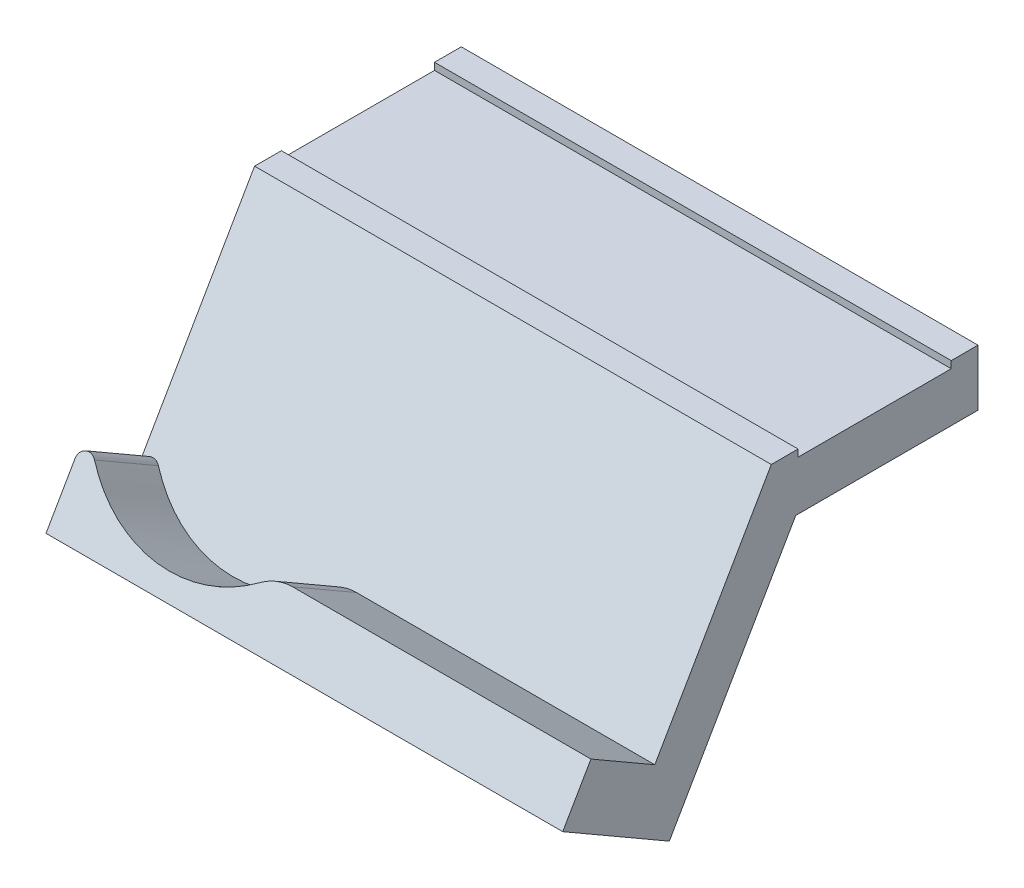
ISO-10303-21;
HEADER;
FILE_DESCRIPTION(('STEP AP214'),'2;1');
FILE_NAME('part.step','',(''),(''),'','','');
FILE_SCHEMA(('AUTOMOTIVE_DESIGN { 1 0 10303 214 1 1 1 1 }'));
ENDSEC;
DATA;
#1=APPLICATION_CONTEXT('core data for automotive mechanical design processes');
#2=APPLICATION_PROTOCOL_DEFINITION('international standard','automotive_design',2000,#1);
#3=PRODUCT_CONTEXT('',#1,'mechanical');
#4=PRODUCT('Part','Part','',(#3));
#5=PRODUCT_RELATED_PRODUCT_CATEGORY('part','',(#4));
#6=PRODUCT_DEFINITION_FORMATION('','',#4);
#7=PRODUCT_DEFINITION_CONTEXT('part definition',#1,'design');
#8=PRODUCT_DEFINITION('design','',#6,#7);
#9=PRODUCT_DEFINITION_SHAPE('','',#8);
#10=(LENGTH_UNIT() NAMED_UNIT(*) SI_UNIT(.MILLI.,.METRE.));
#11=(NAMED_UNIT(*) PLANE_ANGLE_UNIT() SI_UNIT($,.RADIAN.));
#12=(NAMED_UNIT(*) SI_UNIT($,.STERADIAN.) SOLID_ANGLE_UNIT());
#13=UNCERTAINTY_MEASURE_WITH_UNIT(LENGTH_MEASURE(1.E-05),#10,'distance_accuracy_value','');
#14=(GEOMETRIC_REPRESENTATION_CONTEXT(3) GLOBAL_UNCERTAINTY_ASSIGNED_CONTEXT((#13)) GLOBAL_UNIT_ASSIGNED_CONTEXT((#10,
#11,#12)) REPRESENTATION_CONTEXT('',''));
#15=CARTESIAN_POINT('',(0.,0.,0.));
#16=DIRECTION('',(0.,0.,1.));
#17=DIRECTION('',(1.,0.,0.));
#18=AXIS2_PLACEMENT_3D('',#15,#16,#17);
#19=CARTESIAN_POINT('',(55.,31.0444173119616,-43.45));
#20=DIRECTION('',(0.,-1.,0.));
#21=DIRECTION('',(0.,0.,-1.));
#22=AXIS2_PLACEMENT_3D('',#19,#20,#21);
#23=PLANE('',#22);
#24=DIRECTION('',(0.,0.,1.));
#25=VECTOR('',#24,1.);
#26=CARTESIAN_POINT('',(0.,31.0444173119616,-43.45));
#27=LINE('',#26,#25);
#28=CARTESIAN_POINT('',(0.,31.0444173119616,-43.45));
#29=VERTEX_POINT('',#28);
#30=CARTESIAN_POINT('',(0.,31.0444173119616,-40.6));
#31=VERTEX_POINT('',#30);
#32=EDGE_CURVE('E215',#29,#31,#27,.T.);
#33=ORIENTED_EDGE('',*,*,#32,.T.);
#34=DIRECTION('',(-1.,0.,0.));
#35=VECTOR('',#34,1.);
#36=CARTESIAN_POINT('',(0.,31.0444173119616,-40.6));
#37=LINE('',#36,#35);
#38=CARTESIAN_POINT('',(55.,31.0444173119616,-40.6));
#39=VERTEX_POINT('',#38);
#40=EDGE_CURVE('E179',#39,#31,#37,.T.);
#41=ORIENTED_EDGE('',*,*,#40,.F.);
#42=DIRECTION('',(0.,0.,1.));
#43=VECTOR('',#42,1.);
#44=CARTESIAN_POINT('',(55.,31.0444173119616,-43.45));
#45=LINE('',#44,#43);
#46=CARTESIAN_POINT('',(55.,31.0444173119616,-43.45));
#47=VERTEX_POINT('',#46);
#48=EDGE_CURVE('E211',#47,#39,#45,.T.);
#49=ORIENTED_EDGE('',*,*,#48,.F.);
#50=DIRECTION('',(1.,0.,0.));
#51=VECTOR('',#50,1.);
#52=CARTESIAN_POINT('',(55.,31.0444173119616,-43.45));
#53=LINE('',#52,#51);
#54=EDGE_CURVE('E208',#29,#47,#53,.T.);
#55=ORIENTED_EDGE('',*,*,#54,.F.);
#56=EDGE_LOOP('',(#33,#41,#49,#55));
#57=FACE_BOUND('',#56,.T.);
#58=ADVANCED_FACE('F35',(#57),#23,.F.);
#59=CARTESIAN_POINT('',(0.,80.,-25.95));
#60=DIRECTION('',(1.,0.,0.));
#61=DIRECTION('',(0.,0.,-1.));
#62=AXIS2_PLACEMENT_3D('',#59,#60,#61);
#63=PLANE('',#62);
#64=DIRECTION('',(0.,0.,1.));
#65=VECTOR('',#64,1.);
#66=CARTESIAN_POINT('',(0.,30.2944173119616,-40.6));
#67=LINE('',#66,#65);
#68=CARTESIAN_POINT('',(0.,30.2944173119616,-40.6));
#69=VERTEX_POINT('',#68);
#70=CARTESIAN_POINT('',(0.,30.2944173119616,-24.3));
#71=VERTEX_POINT('',#70);
#72=EDGE_CURVE('E175',#69,#71,#67,.T.);
#73=ORIENTED_EDGE('',*,*,#72,.F.);
#74=DIRECTION('',(0.,1.,0.));
#75=VECTOR('',#74,1.);
#76=CARTESIAN_POINT('',(0.,30.2944173119616,-40.6));
#77=LINE('',#76,#75);
#78=EDGE_CURVE('E189',#69,#31,#77,.T.);
#79=ORIENTED_EDGE('',*,*,#78,.T.);
#80=ORIENTED_EDGE('',*,*,#32,.F.);
#81=DIRECTION('',(0.,1.,0.));
#82=VECTOR('',#81,1.);
#83=CARTESIAN_POINT('',(0.,31.0444173119616,-43.45));
#84=LINE('',#83,#82);
#85=CARTESIAN_POINT('',(0.,25.0444173119616,-43.45));
#86=VERTEX_POINT('',#85);
#87=EDGE_CURVE('E206',#86,#29,#84,.T.);
#88=ORIENTED_EDGE('',*,*,#87,.F.);
#89=DIRECTION('',(0.,0.,1.));
#90=VECTOR('',#89,1.);
#91=CARTESIAN_POINT('',(0.,25.0444173119616,-43.45));
#92=LINE('',#91,#90);
#93=CARTESIAN_POINT('',(0.,25.0444173119616,-24.0480762113533));
#94=VERTEX_POINT('',#93);
#95=EDGE_CURVE('E218',#86,#94,#92,.T.);
#96=ORIENTED_EDGE('',*,*,#95,.T.);
#97=DIRECTION('',(0.,-0.866025403784439,0.5));
#98=VECTOR('',#97,1.);
#99=CARTESIAN_POINT('',(0.,20.5444173119616,-21.45));
#100=LINE('',#99,#98);
#101=CARTESIAN_POINT('',(0.,1.7458348754011,-10.5966333698684));
#102=VERTEX_POINT('',#101);
#103=EDGE_CURVE('E219',#94,#102,#100,.T.);
#104=ORIENTED_EDGE('',*,*,#103,.T.);
#105=DIRECTION('',(0.,0.5,0.866025403784439));
#106=VECTOR('',#105,1.);
#107=CARTESIAN_POINT('',(0.,8.29681670589062,0.750000000000018));
#108=LINE('',#107,#106);
#109=CARTESIAN_POINT('',(0.,8.29681670589062,0.750000000000018));
#110=VERTEX_POINT('',#109);
#111=EDGE_CURVE('E171',#102,#110,#108,.T.);
#112=ORIENTED_EDGE('',*,*,#111,.T.);
#113=DIRECTION('',(0.,0.866025403784439,-0.499999999999999));
#114=VECTOR('',#113,1.);
#115=CARTESIAN_POINT('',(0.,5.2657277926451,2.49999999999998));
#116=LINE('',#115,#114);
#117=CARTESIAN_POINT('',(0.,13.643118878009,-2.33668899824161));
#118=VERTEX_POINT('',#117);
#119=EDGE_CURVE('E154',#110,#118,#116,.T.);
#120=ORIENTED_EDGE('',*,*,#119,.T.);
#121=DIRECTION('',(0.,0.500000000000004,0.866025403784436));
#122=VECTOR('',#121,1.);
#123=CARTESIAN_POINT('',(0.,9.71713704751949,-9.1366889982416));
#124=LINE('',#123,#122);
#125=CARTESIAN_POINT('',(0.,9.71713704751948,-9.1366889982416));
#126=VERTEX_POINT('',#125);
#127=EDGE_CURVE('E247',#118,#126,#124,.F.);
#128=ORIENTED_EDGE('',*,*,#127,.T.);
#129=DIRECTION('',(0.,-0.866025403784436,0.500000000000004));
#130=VECTOR('',#129,1.);
#131=CARTESIAN_POINT('',(0.,69.7096614865052,-43.7733891324556));
#132=LINE('',#131,#130);
#133=CARTESIAN_POINT('',(0.,31.0444173119616,-21.45));
#134=VERTEX_POINT('',#133);
#135=EDGE_CURVE('E229',#134,#126,#132,.T.);
#136=ORIENTED_EDGE('',*,*,#135,.F.);
#137=CARTESIAN_POINT('',(0.,31.0444173119616,-24.3));
#138=VERTEX_POINT('',#137);
#139=EDGE_CURVE('E214',#138,#134,#27,.T.);
#140=ORIENTED_EDGE('',*,*,#139,.F.);
#141=DIRECTION('',(0.,1.,0.));
#142=VECTOR('',#141,1.);
#143=CARTESIAN_POINT('',(0.,30.2944173119616,-24.3));
#144=LINE('',#143,#142);
#145=EDGE_CURVE('E52',#71,#138,#144,.T.);
#146=ORIENTED_EDGE('',*,*,#145,.F.);
#147=EDGE_LOOP('',(#73,#79,#80,#88,#96,#104,#112,#120,#128,#136,#140,#146));
#148=FACE_BOUND('',#147,.T.);
#149=ADVANCED_FACE('F272',(#148),#63,.F.);
#150=CARTESIAN_POINT('',(55.,80.,-25.95));
#151=DIRECTION('',(1.,0.,0.));
#152=DIRECTION('',(0.,0.,-1.));
#153=AXIS2_PLACEMENT_3D('',#150,#151,#152);
#154=PLANE('',#153);
#155=DIRECTION('',(0.,1.,0.));
#156=VECTOR('',#155,1.);
#157=CARTESIAN_POINT('',(55.,30.2944173119616,-40.6));
#158=LINE('',#157,#156);
#159=CARTESIAN_POINT('',(55.,30.2944173119616,-40.6));
#160=VERTEX_POINT('',#159);
#161=EDGE_CURVE('E193',#160,#39,#158,.T.);
#162=ORIENTED_EDGE('',*,*,#161,.F.);
#163=DIRECTION('',(0.,0.,-1.));
#164=VECTOR('',#163,1.);
#165=CARTESIAN_POINT('',(55.,30.2944173119616,-40.6));
#166=LINE('',#165,#164);
#167=CARTESIAN_POINT('',(55.,30.2944173119616,-24.3));
#168=VERTEX_POINT('',#167);
#169=EDGE_CURVE('E182',#168,#160,#166,.T.);
#170=ORIENTED_EDGE('',*,*,#169,.F.);
#171=DIRECTION('',(0.,1.,0.));
#172=VECTOR('',#171,1.);
#173=CARTESIAN_POINT('',(55.,30.2944173119616,-24.3));
#174=LINE('',#173,#172);
#175=CARTESIAN_POINT('',(55.,31.0444173119616,-24.3));
#176=VERTEX_POINT('',#175);
#177=EDGE_CURVE('E195',#168,#176,#174,.T.);
#178=ORIENTED_EDGE('',*,*,#177,.T.);
#179=CARTESIAN_POINT('',(55.,31.0444173119616,-21.45));
#180=VERTEX_POINT('',#179);
#181=EDGE_CURVE('E210',#176,#180,#45,.T.);
#182=ORIENTED_EDGE('',*,*,#181,.T.);
#183=DIRECTION('',(0.,0.866025403784436,-0.500000000000004));
#184=VECTOR('',#183,1.);
#185=CARTESIAN_POINT('',(55.,9.99999999999999,-9.3));
#186=LINE('',#185,#184);
#187=CARTESIAN_POINT('',(55.,9.56698729810782,-9.05000000000003));
#188=VERTEX_POINT('',#187);
#189=EDGE_CURVE('E238',#188,#180,#186,.T.);
#190=ORIENTED_EDGE('',*,*,#189,.F.);
#191=DIRECTION('',(0.,-0.5,-0.866025403784439));
#192=VECTOR('',#191,1.);
#193=CARTESIAN_POINT('',(55.,13.4929691285973,-2.25000000000002));
#194=LINE('',#193,#192);
#195=CARTESIAN_POINT('',(55.,13.4929691285973,-2.25000000000002));
#196=VERTEX_POINT('',#195);
#197=EDGE_CURVE('E151',#196,#188,#194,.T.);
#198=ORIENTED_EDGE('',*,*,#197,.F.);
#199=DIRECTION('',(0.,0.866025403784439,-0.499999999999999));
#200=VECTOR('',#199,1.);
#201=CARTESIAN_POINT('',(55.,5.2657277926451,2.49999999999998));
#202=LINE('',#201,#200);
#203=CARTESIAN_POINT('',(55.,8.29681670589062,0.750000000000002));
#204=VERTEX_POINT('',#203);
#205=EDGE_CURVE('E143',#204,#196,#202,.T.);
#206=ORIENTED_EDGE('',*,*,#205,.F.);
#207=DIRECTION('',(0.,-0.5,-0.866025403784439));
#208=VECTOR('',#207,1.);
#209=CARTESIAN_POINT('',(55.,8.29681670589062,0.750000000000002));
#210=LINE('',#209,#208);
#211=CARTESIAN_POINT('',(55.,1.7458348754011,-10.5966333698684));
#212=VERTEX_POINT('',#211);
#213=EDGE_CURVE('E148',#204,#212,#210,.T.);
#214=ORIENTED_EDGE('',*,*,#213,.T.);
#215=DIRECTION('',(0.,-0.866025403784439,0.5));
#216=VECTOR('',#215,1.);
#217=CARTESIAN_POINT('',(55.,20.5444173119616,-21.45));
#218=LINE('',#217,#216);
#219=CARTESIAN_POINT('',(55.,25.0444173119616,-24.0480762113533));
#220=VERTEX_POINT('',#219);
#221=EDGE_CURVE('E222',#220,#212,#218,.T.);
#222=ORIENTED_EDGE('',*,*,#221,.F.);
#223=DIRECTION('',(0.,0.,1.));
#224=VECTOR('',#223,1.);
#225=CARTESIAN_POINT('',(55.,25.0444173119616,-43.45));
#226=LINE('',#225,#224);
#227=CARTESIAN_POINT('',(55.,25.0444173119616,-43.45));
#228=VERTEX_POINT('',#227);
#229=EDGE_CURVE('E224',#228,#220,#226,.T.);
#230=ORIENTED_EDGE('',*,*,#229,.F.);
#231=DIRECTION('',(0.,-1.,0.));
#232=VECTOR('',#231,1.);
#233=CARTESIAN_POINT('',(55.,31.0444173119616,-43.45));
#234=LINE('',#233,#232);
#235=EDGE_CURVE('E201',#47,#228,#234,.T.);
#236=ORIENTED_EDGE('',*,*,#235,.F.);
#237=ORIENTED_EDGE('',*,*,#48,.T.);
#238=EDGE_LOOP('',(#162,#170,#178,#182,#190,#198,#206,#214,#222,#230,#236,#237));
#239=FACE_BOUND('',#238,.T.);
#240=ADVANCED_FACE('F146',(#239),#154,.T.);
#241=CARTESIAN_POINT('',(5.,9.99999999999999,-9.3));
#242=DIRECTION('',(0.,-0.500000000000004,-0.866025403784436));
#243=DIRECTION('',(0.,0.866025403784437,-0.500000000000004));
#244=AXIS2_PLACEMENT_3D('',#241,#242,#243);
#245=PLANE('',#244);
#246=ORIENTED_EDGE('',*,*,#189,.T.);
#247=DIRECTION('',(1.,0.,0.));
#248=VECTOR('',#247,1.);
#249=CARTESIAN_POINT('',(0.,31.0444173119616,-21.45));
#250=LINE('',#249,#248);
#251=EDGE_CURVE('E221',#134,#180,#250,.T.);
#252=ORIENTED_EDGE('',*,*,#251,.F.);
#253=ORIENTED_EDGE('',*,*,#135,.T.);
#254=CARTESIAN_POINT('',(1.,9.71713704751948,-9.1366889982416));
#255=DIRECTION('',(0.,-0.500000000000004,-0.866025403784436));
#256=DIRECTION('',(0.,0.866025403784437,-0.500000000000004));
#257=AXIS2_PLACEMENT_3D('',#254,#255,#256);
#258=CIRCLE('',#257,1.);
#259=CARTESIAN_POINT('',(1.7457627118644,10.2940932704641,-9.4697948288693));
#260=VERTEX_POINT('',#259);
#261=EDGE_CURVE('E250',#126,#260,#258,.T.);
#262=ORIENTED_EDGE('',*,*,#261,.T.);
#263=CARTESIAN_POINT('',(12.,18.2272413359521,-14.05));
#264=DIRECTION('',(0.,0.500000000000004,0.866025403784436));
#265=DIRECTION('',(0.,-0.866025403784436,0.500000000000004));
#266=AXIS2_PLACEMENT_3D('',#263,#264,#265);
#267=CIRCLE('',#266,13.75);
#268=CARTESIAN_POINT('',(20.2499999999999,8.70096189432322,-8.54999999999993));
#269=VERTEX_POINT('',#268);
#270=EDGE_CURVE('E227',#260,#269,#267,.T.);
#271=ORIENTED_EDGE('',*,*,#270,.T.);
#272=CARTESIAN_POINT('',(23.2499999999998,5.23686027918544,-6.54999999999989));
#273=DIRECTION('',(0.,-0.500000000000004,-0.866025403784436));
#274=DIRECTION('',(0.,0.866025403784437,-0.500000000000004));
#275=AXIS2_PLACEMENT_3D('',#272,#273,#274);
#276=CIRCLE('',#275,5.);
#277=CARTESIAN_POINT('',(23.2499999999998,9.56698729810782,-9.05000000000002));
#278=VERTEX_POINT('',#277);
#279=EDGE_CURVE('E11',#269,#278,#276,.T.);
#280=ORIENTED_EDGE('',*,*,#279,.T.);
#281=DIRECTION('',(1.,0.,0.));
#282=VECTOR('',#281,1.);
#283=CARTESIAN_POINT('',(-4.18168466749612,9.56698729810782,-9.05000000000002));
#284=LINE('',#283,#282);
#285=EDGE_CURVE('E155',#278,#188,#284,.T.);
#286=ORIENTED_EDGE('',*,*,#285,.T.);
#287=EDGE_LOOP('',(#246,#252,#253,#262,#271,#280,#286));
#288=FACE_BOUND('',#287,.T.);
#289=ADVANCED_FACE('F293',(#288),#245,.F.);
#290=CARTESIAN_POINT('',(-4.18168466749612,13.4929691285973,-2.25));
#291=DIRECTION('',(0.,-0.866025403784439,0.5));
#292=DIRECTION('',(0.,-0.5,-0.866025403784439));
#293=AXIS2_PLACEMENT_3D('',#290,#291,#292);
#294=PLANE('',#293);
#295=ORIENTED_EDGE('',*,*,#285,.F.);
#296=DIRECTION('',(0.,0.5,0.866025403784439));
#297=VECTOR('',#296,1.);
#298=CARTESIAN_POINT('',(23.2499999999998,13.4929691285972,-2.25000000000007));
#299=LINE('',#298,#297);
#300=CARTESIAN_POINT('',(23.2499999999998,13.4929691285973,-2.25000000000001));
#301=VERTEX_POINT('',#300);
#302=EDGE_CURVE('E255',#278,#301,#299,.T.);
#303=ORIENTED_EDGE('',*,*,#302,.T.);
#304=DIRECTION('',(1.,0.,0.));
#305=VECTOR('',#304,1.);
#306=CARTESIAN_POINT('',(-4.18168466749612,13.4929691285973,-2.25));
#307=LINE('',#306,#305);
#308=EDGE_CURVE('E235',#301,#196,#307,.T.);
#309=ORIENTED_EDGE('',*,*,#308,.T.);
#310=ORIENTED_EDGE('',*,*,#197,.T.);
#311=EDGE_LOOP('',(#295,#303,#309,#310));
#312=FACE_BOUND('',#311,.T.);
#313=ADVANCED_FACE('F295',(#312),#294,.F.);
#314=CARTESIAN_POINT('',(0.,5.2657277926451,2.49999999999998));
#315=DIRECTION('',(0.,-0.499999999999999,-0.866025403784439));
#316=DIRECTION('',(0.,0.866025403784439,-0.499999999999999));
#317=AXIS2_PLACEMENT_3D('',#314,#315,#316);
#318=PLANE('',#317);
#319=ORIENTED_EDGE('',*,*,#308,.F.);
#320=CARTESIAN_POINT('',(23.2499999999998,9.16284210967492,0.250000000000077));
#321=DIRECTION('',(0.,-0.499999999999999,-0.866025403784439));
#322=DIRECTION('',(0.,0.866025403784439,-0.499999999999999));
#323=AXIS2_PLACEMENT_3D('',#320,#321,#322);
#324=CIRCLE('',#323,5.);
#325=CARTESIAN_POINT('',(20.2499999999999,12.6269437248127,-1.74999999999995));
#326=VERTEX_POINT('',#325);
#327=EDGE_CURVE('E44',#301,#326,#324,.F.);
#328=ORIENTED_EDGE('',*,*,#327,.T.);
#329=CARTESIAN_POINT('',(12.,22.1532231664416,-7.25));
#330=DIRECTION('',(0.,-0.499999999999999,-0.866025403784439));
#331=DIRECTION('',(0.,0.866025403784439,-0.499999999999999));
#332=AXIS2_PLACEMENT_3D('',#329,#330,#331);
#333=CIRCLE('',#332,13.75);
#334=CARTESIAN_POINT('',(1.74576271186441,14.2200751009536,-2.6697948288693));
#335=VERTEX_POINT('',#334);
#336=EDGE_CURVE('E231',#335,#326,#333,.F.);
#337=ORIENTED_EDGE('',*,*,#336,.F.);
#338=CARTESIAN_POINT('',(1.,13.643118878009,-2.33668899824162));
#339=DIRECTION('',(0.,-0.499999999999999,-0.866025403784439));
#340=DIRECTION('',(0.,0.866025403784439,-0.499999999999999));
#341=AXIS2_PLACEMENT_3D('',#338,#339,#340);
#342=CIRCLE('',#341,1.);
#343=EDGE_CURVE('E245',#335,#118,#342,.F.);
#344=ORIENTED_EDGE('',*,*,#343,.T.);
#345=ORIENTED_EDGE('',*,*,#119,.F.);
#346=DIRECTION('',(1.,0.,0.));
#347=VECTOR('',#346,1.);
#348=CARTESIAN_POINT('',(-14.4205184332333,8.29681670589062,0.750000000000018));
#349=LINE('',#348,#347);
#350=EDGE_CURVE('E158',#110,#204,#349,.T.);
#351=ORIENTED_EDGE('',*,*,#350,.T.);
#352=ORIENTED_EDGE('',*,*,#205,.T.);
#353=EDGE_LOOP('',(#319,#328,#337,#344,#345,#351,#352));
#354=FACE_BOUND('',#353,.T.);
#355=ADVANCED_FACE('F159',(#354),#318,.F.);
#356=CARTESIAN_POINT('',(12.,39.7542594635501,23.2358891324555));
#357=DIRECTION('',(0.,-0.500000000000004,-0.866025403784436));
#358=DIRECTION('',(0.,0.866025403784436,-0.500000000000004));
#359=AXIS2_PLACEMENT_3D('',#356,#357,#358);
#360=CYLINDRICAL_SURFACE('',#359,13.75);
#361=ORIENTED_EDGE('',*,*,#336,.T.);
#362=DIRECTION('',(0.,-0.500000000000004,-0.866025403784436));
#363=VECTOR('',#362,1.);
#364=CARTESIAN_POINT('',(20.2499999999999,30.2279800219212,28.7358891324556));
#365=LINE('',#364,#363);
#366=EDGE_CURVE('E252',#326,#269,#365,.T.);
#367=ORIENTED_EDGE('',*,*,#366,.T.);
#368=ORIENTED_EDGE('',*,*,#270,.F.);
#369=DIRECTION('',(0.,-0.500000000000004,-0.866025403784436));
#370=VECTOR('',#369,1.);
#371=CARTESIAN_POINT('',(1.74576271186441,31.821111398062,27.8160943035862));
#372=LINE('',#371,#370);
#373=EDGE_CURVE('E242',#260,#335,#372,.F.);
#374=ORIENTED_EDGE('',*,*,#373,.T.);
#375=EDGE_LOOP('',(#361,#367,#368,#374));
#376=FACE_BOUND('',#375,.T.);
#377=ADVANCED_FACE('F303',(#376),#360,.F.);
#378=CARTESIAN_POINT('',(1.,31.2441551751174,28.1492001342139));
#379=DIRECTION('',(0.,-0.500000000000004,-0.866025403784436));
#380=DIRECTION('',(0.,0.866025403784436,-0.500000000000004));
#381=AXIS2_PLACEMENT_3D('',#378,#379,#380);
#382=CYLINDRICAL_SURFACE('',#381,1.);
#383=ORIENTED_EDGE('',*,*,#261,.F.);
#384=ORIENTED_EDGE('',*,*,#127,.F.);
#385=ORIENTED_EDGE('',*,*,#343,.F.);
#386=ORIENTED_EDGE('',*,*,#373,.F.);
#387=EDGE_LOOP('',(#383,#384,#385,#386));
#388=FACE_BOUND('',#387,.T.);
#389=ADVANCED_FACE('F308',(#388),#382,.T.);
#390=CARTESIAN_POINT('',(23.2499999999998,26.7638784067834,30.7358891324555));
#391=DIRECTION('',(0.,-0.500000000000004,-0.866025403784436));
#392=DIRECTION('',(0.,0.866025403784436,-0.500000000000004));
#393=AXIS2_PLACEMENT_3D('',#390,#391,#392);
#394=CYLINDRICAL_SURFACE('',#393,5.);
#395=ORIENTED_EDGE('',*,*,#327,.F.);
#396=ORIENTED_EDGE('',*,*,#302,.F.);
#397=ORIENTED_EDGE('',*,*,#279,.F.);
#398=ORIENTED_EDGE('',*,*,#366,.F.);
#399=EDGE_LOOP('',(#395,#396,#397,#398));
#400=FACE_BOUND('',#399,.T.);
#401=ADVANCED_FACE('F37',(#400),#394,.T.);
#402=CARTESIAN_POINT('',(0.,20.5444173119616,-21.45));
#403=DIRECTION('',(0.,0.5,0.866025403784439));
#404=DIRECTION('',(0.,-0.866025403784439,0.5));
#405=AXIS2_PLACEMENT_3D('',#402,#403,#404);
#406=PLANE('',#405);
#407=ORIENTED_EDGE('',*,*,#221,.T.);
#408=DIRECTION('',(1.,0.,0.));
#409=VECTOR('',#408,1.);
#410=CARTESIAN_POINT('',(-14.4205184332333,1.7458348754011,-10.5966333698684));
#411=LINE('',#410,#409);
#412=EDGE_CURVE('E164',#102,#212,#411,.T.);
#413=ORIENTED_EDGE('',*,*,#412,.F.);
#414=ORIENTED_EDGE('',*,*,#103,.F.);
#415=DIRECTION('',(-1.,0.,0.));
#416=VECTOR('',#415,1.);
#417=CARTESIAN_POINT('',(55.,25.0444173119616,-24.0480762113533));
#418=LINE('',#417,#416);
#419=EDGE_CURVE('E192',#220,#94,#418,.T.);
#420=ORIENTED_EDGE('',*,*,#419,.F.);
#421=EDGE_LOOP('',(#407,#413,#414,#420));
#422=FACE_BOUND('',#421,.T.);
#423=ADVANCED_FACE('F269',(#422),#406,.F.);
#424=CARTESIAN_POINT('',(55.,25.0444173119616,-43.45));
#425=DIRECTION('',(0.,1.,0.));
#426=DIRECTION('',(0.,0.,1.));
#427=AXIS2_PLACEMENT_3D('',#424,#425,#426);
#428=PLANE('',#427);
#429=ORIENTED_EDGE('',*,*,#229,.T.);
#430=ORIENTED_EDGE('',*,*,#419,.T.);
#431=ORIENTED_EDGE('',*,*,#95,.F.);
#432=DIRECTION('',(-1.,0.,0.));
#433=VECTOR('',#432,1.);
#434=CARTESIAN_POINT('',(55.,25.0444173119616,-43.45));
#435=LINE('',#434,#433);
#436=EDGE_CURVE('E204',#228,#86,#435,.T.);
#437=ORIENTED_EDGE('',*,*,#436,.F.);
#438=EDGE_LOOP('',(#429,#430,#431,#437));
#439=FACE_BOUND('',#438,.T.);
#440=ADVANCED_FACE('F264',(#439),#428,.F.);
#441=ORIENTED_EDGE('',*,*,#181,.F.);
#442=DIRECTION('',(1.,0.,0.));
#443=VECTOR('',#442,1.);
#444=CARTESIAN_POINT('',(0.,31.0444173119616,-24.3));
#445=LINE('',#444,#443);
#446=EDGE_CURVE('E174',#138,#176,#445,.T.);
#447=ORIENTED_EDGE('',*,*,#446,.F.);
#448=ORIENTED_EDGE('',*,*,#139,.T.);
#449=ORIENTED_EDGE('',*,*,#251,.T.);
#450=EDGE_LOOP('',(#441,#447,#448,#449));
#451=FACE_BOUND('',#450,.T.);
#452=ADVANCED_FACE('F292',(#451),#23,.F.);
#453=CARTESIAN_POINT('',(0.,0.,-43.45));
#454=DIRECTION('',(0.,0.,-1.));
#455=DIRECTION('',(-1.,0.,0.));
#456=AXIS2_PLACEMENT_3D('',#453,#454,#455);
#457=PLANE('',#456);
#458=ORIENTED_EDGE('',*,*,#235,.T.);
#459=ORIENTED_EDGE('',*,*,#436,.T.);
#460=ORIENTED_EDGE('',*,*,#87,.T.);
#461=ORIENTED_EDGE('',*,*,#54,.T.);
#462=EDGE_LOOP('',(#458,#459,#460,#461));
#463=FACE_BOUND('',#462,.T.);
#464=ADVANCED_FACE('F277',(#463),#457,.T.);
#465=CARTESIAN_POINT('',(0.,30.2944173119616,-40.6));
#466=DIRECTION('',(0.,0.,-1.));
#467=DIRECTION('',(-1.,0.,0.));
#468=AXIS2_PLACEMENT_3D('',#465,#466,#467);
#469=PLANE('',#468);
#470=ORIENTED_EDGE('',*,*,#40,.T.);
#471=ORIENTED_EDGE('',*,*,#78,.F.);
#472=DIRECTION('',(-1.,0.,0.));
#473=VECTOR('',#472,1.);
#474=CARTESIAN_POINT('',(0.,30.2944173119616,-40.6));
#475=LINE('',#474,#473);
#476=EDGE_CURVE('E184',#160,#69,#475,.T.);
#477=ORIENTED_EDGE('',*,*,#476,.F.);
#478=ORIENTED_EDGE('',*,*,#161,.T.);
#479=EDGE_LOOP('',(#470,#471,#477,#478));
#480=FACE_BOUND('',#479,.T.);
#481=ADVANCED_FACE('F284',(#480),#469,.F.);
#482=CARTESIAN_POINT('',(0.,30.2944173119616,-24.3));
#483=DIRECTION('',(0.,0.,1.));
#484=DIRECTION('',(1.,0.,0.));
#485=AXIS2_PLACEMENT_3D('',#482,#483,#484);
#486=PLANE('',#485);
#487=ORIENTED_EDGE('',*,*,#446,.T.);
#488=ORIENTED_EDGE('',*,*,#177,.F.);
#489=DIRECTION('',(1.,0.,0.));
#490=VECTOR('',#489,1.);
#491=CARTESIAN_POINT('',(0.,30.2944173119616,-24.3));
#492=LINE('',#491,#490);
#493=EDGE_CURVE('E178',#71,#168,#492,.T.);
#494=ORIENTED_EDGE('',*,*,#493,.F.);
#495=ORIENTED_EDGE('',*,*,#145,.T.);
#496=EDGE_LOOP('',(#487,#488,#494,#495));
#497=FACE_BOUND('',#496,.T.);
#498=ADVANCED_FACE('F386',(#497),#486,.F.);
#499=CARTESIAN_POINT('',(0.,30.2944173119616,0.));
#500=DIRECTION('',(0.,1.,0.));
#501=DIRECTION('',(0.,0.,1.));
#502=AXIS2_PLACEMENT_3D('',#499,#500,#501);
#503=PLANE('',#502);
#504=ORIENTED_EDGE('',*,*,#72,.T.);
#505=ORIENTED_EDGE('',*,*,#493,.T.);
#506=ORIENTED_EDGE('',*,*,#169,.T.);
#507=ORIENTED_EDGE('',*,*,#476,.T.);
#508=EDGE_LOOP('',(#504,#505,#506,#507));
#509=FACE_BOUND('',#508,.T.);
#510=ADVANCED_FACE('F286',(#509),#503,.T.);
#511=CARTESIAN_POINT('',(-14.4205184332333,8.29681670589062,0.750000000000018));
#512=DIRECTION('',(0.,-0.866025403784439,0.5));
#513=DIRECTION('',(0.,-0.5,-0.866025403784439));
#514=AXIS2_PLACEMENT_3D('',#511,#512,#513);
#515=PLANE('',#514);
#516=ORIENTED_EDGE('',*,*,#111,.F.);
#517=ORIENTED_EDGE('',*,*,#412,.T.);
#518=ORIENTED_EDGE('',*,*,#213,.F.);
#519=ORIENTED_EDGE('',*,*,#350,.F.);
#520=EDGE_LOOP('',(#516,#517,#518,#519));
#521=FACE_BOUND('',#520,.T.);
#522=ADVANCED_FACE('F167',(#521),#515,.T.);
#523=CLOSED_SHELL('',(#58,#149,#240,#289,#313,#355,#377,#389,#401,#423,#440,#452,#464,#481,#498,
#510,#522));
#524=MANIFOLD_SOLID_BREP('B2',#523);
#525=ADVANCED_BREP_SHAPE_REPRESENTATION('',(#18,#524),#14);
#526=SHAPE_DEFINITION_REPRESENTATION(#9,#525);
ENDSEC;
END-ISO-10303-21;
